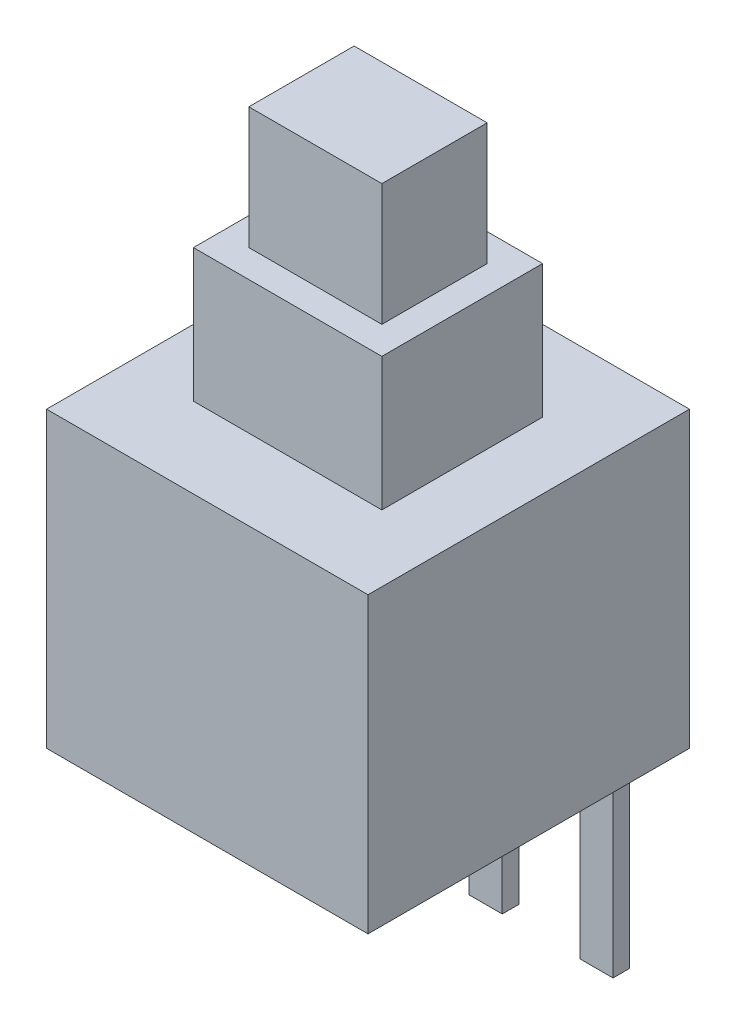
ISO-10303-21;
HEADER;
FILE_DESCRIPTION(('STEP AP214'),'2;1');
FILE_NAME('part.step','',(''),(''),'','','');
FILE_SCHEMA(('AUTOMOTIVE_DESIGN { 1 0 10303 214 1 1 1 1 }'));
ENDSEC;
DATA;
#1=APPLICATION_CONTEXT('core data for automotive mechanical design processes');
#2=APPLICATION_PROTOCOL_DEFINITION('international standard','automotive_design',2000,#1);
#3=PRODUCT_CONTEXT('',#1,'mechanical');
#4=PRODUCT('Part','Part','',(#3));
#5=PRODUCT_RELATED_PRODUCT_CATEGORY('part','',(#4));
#6=PRODUCT_DEFINITION_FORMATION('','',#4);
#7=PRODUCT_DEFINITION_CONTEXT('part definition',#1,'design');
#8=PRODUCT_DEFINITION('design','',#6,#7);
#9=PRODUCT_DEFINITION_SHAPE('','',#8);
#10=(LENGTH_UNIT() NAMED_UNIT(*) SI_UNIT(.MILLI.,.METRE.));
#11=(NAMED_UNIT(*) PLANE_ANGLE_UNIT() SI_UNIT($,.RADIAN.));
#12=(NAMED_UNIT(*) SI_UNIT($,.STERADIAN.) SOLID_ANGLE_UNIT());
#13=UNCERTAINTY_MEASURE_WITH_UNIT(LENGTH_MEASURE(1.E-05),#10,'distance_accuracy_value','');
#14=(GEOMETRIC_REPRESENTATION_CONTEXT(3) GLOBAL_UNCERTAINTY_ASSIGNED_CONTEXT((#13)) GLOBAL_UNIT_ASSIGNED_CONTEXT((#10,
#11,#12)) REPRESENTATION_CONTEXT('',''));
#15=CARTESIAN_POINT('',(0.,0.,0.));
#16=DIRECTION('',(0.,0.,1.));
#17=DIRECTION('',(1.,0.,0.));
#18=AXIS2_PLACEMENT_3D('',#15,#16,#17);
#19=CARTESIAN_POINT('',(0.,0.,0.));
#20=DIRECTION('',(0.,1.,0.));
#21=DIRECTION('',(0.,0.,1.));
#22=AXIS2_PLACEMENT_3D('',#19,#20,#21);
#23=PLANE('',#22);
#24=DIRECTION('',(0.,0.,-1.));
#25=VECTOR('',#24,1.);
#26=CARTESIAN_POINT('',(-2.3,0.,-2.42183407061702));
#27=LINE('',#26,#25);
#28=CARTESIAN_POINT('',(-2.3,0.,-2.12183407061702));
#29=VERTEX_POINT('',#28);
#30=CARTESIAN_POINT('',(-2.3,0.,-2.42183407061702));
#31=VERTEX_POINT('',#30);
#32=EDGE_CURVE('E216',#29,#31,#27,.T.);
#33=ORIENTED_EDGE('',*,*,#32,.F.);
#34=DIRECTION('',(-1.,0.,0.));
#35=VECTOR('',#34,1.);
#36=CARTESIAN_POINT('',(-1.7,0.,-2.12183407061702));
#37=LINE('',#36,#35);
#38=CARTESIAN_POINT('',(-1.7,0.,-2.12183407061702));
#39=VERTEX_POINT('',#38);
#40=EDGE_CURVE('E229',#39,#29,#37,.T.);
#41=ORIENTED_EDGE('',*,*,#40,.F.);
#42=DIRECTION('',(0.,0.,1.));
#43=VECTOR('',#42,1.);
#44=CARTESIAN_POINT('',(-1.7,0.,-2.42183407061702));
#45=LINE('',#44,#43);
#46=CARTESIAN_POINT('',(-1.7,0.,-2.42183407061702));
#47=VERTEX_POINT('',#46);
#48=EDGE_CURVE('E238',#47,#39,#45,.T.);
#49=ORIENTED_EDGE('',*,*,#48,.F.);
#50=DIRECTION('',(1.,0.,0.));
#51=VECTOR('',#50,1.);
#52=CARTESIAN_POINT('',(-1.7,0.,-2.42183407061702));
#53=LINE('',#52,#51);
#54=EDGE_CURVE('E219',#31,#47,#53,.T.);
#55=ORIENTED_EDGE('',*,*,#54,.F.);
#56=EDGE_LOOP('',(#33,#41,#49,#55));
#57=FACE_BOUND('',#56,.T.);
#58=DIRECTION('',(0.,0.,-1.));
#59=VECTOR('',#58,1.);
#60=CARTESIAN_POINT('',(2.9,0.,-2.9));
#61=LINE('',#60,#59);
#62=CARTESIAN_POINT('',(2.9,0.,2.9));
#63=VERTEX_POINT('',#62);
#64=CARTESIAN_POINT('',(2.9,0.,-2.9));
#65=VERTEX_POINT('',#64);
#66=EDGE_CURVE('E353',#63,#65,#61,.T.);
#67=ORIENTED_EDGE('',*,*,#66,.F.);
#68=DIRECTION('',(1.,0.,0.));
#69=VECTOR('',#68,1.);
#70=CARTESIAN_POINT('',(-2.9,0.,2.9));
#71=LINE('',#70,#69);
#72=CARTESIAN_POINT('',(-2.9,0.,2.9));
#73=VERTEX_POINT('',#72);
#74=EDGE_CURVE('E358',#73,#63,#71,.T.);
#75=ORIENTED_EDGE('',*,*,#74,.F.);
#76=DIRECTION('',(0.,0.,1.));
#77=VECTOR('',#76,1.);
#78=CARTESIAN_POINT('',(-2.9,0.,-2.9));
#79=LINE('',#78,#77);
#80=CARTESIAN_POINT('',(-2.9,0.,-2.9));
#81=VERTEX_POINT('',#80);
#82=EDGE_CURVE('E369',#81,#73,#79,.T.);
#83=ORIENTED_EDGE('',*,*,#82,.F.);
#84=DIRECTION('',(-1.,0.,0.));
#85=VECTOR('',#84,1.);
#86=CARTESIAN_POINT('',(-2.9,0.,-2.9));
#87=LINE('',#86,#85);
#88=EDGE_CURVE('E367',#65,#81,#87,.T.);
#89=ORIENTED_EDGE('',*,*,#88,.F.);
#90=EDGE_LOOP('',(#67,#75,#83,#89));
#91=FACE_BOUND('',#90,.T.);
#92=DIRECTION('',(0.,0.,-1.));
#93=VECTOR('',#92,1.);
#94=CARTESIAN_POINT('',(-0.3,0.,-2.42183407061702));
#95=LINE('',#94,#93);
#96=CARTESIAN_POINT('',(-0.3,0.,-2.12183407061702));
#97=VERTEX_POINT('',#96);
#98=CARTESIAN_POINT('',(-0.3,0.,-2.42183407061702));
#99=VERTEX_POINT('',#98);
#100=EDGE_CURVE('E254',#97,#99,#95,.T.);
#101=ORIENTED_EDGE('',*,*,#100,.F.);
#102=DIRECTION('',(-1.,0.,0.));
#103=VECTOR('',#102,1.);
#104=CARTESIAN_POINT('',(0.3,0.,-2.12183407061702));
#105=LINE('',#104,#103);
#106=CARTESIAN_POINT('',(0.3,0.,-2.12183407061702));
#107=VERTEX_POINT('',#106);
#108=EDGE_CURVE('E259',#107,#97,#105,.T.);
#109=ORIENTED_EDGE('',*,*,#108,.F.);
#110=DIRECTION('',(0.,0.,1.));
#111=VECTOR('',#110,1.);
#112=CARTESIAN_POINT('',(0.3,0.,-2.42183407061702));
#113=LINE('',#112,#111);
#114=CARTESIAN_POINT('',(0.3,0.,-2.42183407061702));
#115=VERTEX_POINT('',#114);
#116=EDGE_CURVE('E271',#115,#107,#113,.T.);
#117=ORIENTED_EDGE('',*,*,#116,.F.);
#118=DIRECTION('',(1.,0.,0.));
#119=VECTOR('',#118,1.);
#120=CARTESIAN_POINT('',(0.3,0.,-2.42183407061702));
#121=LINE('',#120,#119);
#122=EDGE_CURVE('E268',#99,#115,#121,.T.);
#123=ORIENTED_EDGE('',*,*,#122,.F.);
#124=EDGE_LOOP('',(#101,#109,#117,#123));
#125=FACE_BOUND('',#124,.T.);
#126=DIRECTION('',(0.,0.,-1.));
#127=VECTOR('',#126,1.);
#128=CARTESIAN_POINT('',(1.7,0.,-2.42183407061702));
#129=LINE('',#128,#127);
#130=CARTESIAN_POINT('',(1.7,0.,-2.12183407061702));
#131=VERTEX_POINT('',#130);
#132=CARTESIAN_POINT('',(1.7,0.,-2.42183407061702));
#133=VERTEX_POINT('',#132);
#134=EDGE_CURVE('E215',#131,#133,#129,.T.);
#135=ORIENTED_EDGE('',*,*,#134,.F.);
#136=DIRECTION('',(-1.,0.,0.));
#137=VECTOR('',#136,1.);
#138=CARTESIAN_POINT('',(2.3,0.,-2.12183407061702));
#139=LINE('',#138,#137);
#140=CARTESIAN_POINT('',(2.3,0.,-2.12183407061702));
#141=VERTEX_POINT('',#140);
#142=EDGE_CURVE('E212',#141,#131,#139,.T.);
#143=ORIENTED_EDGE('',*,*,#142,.F.);
#144=DIRECTION('',(0.,0.,1.));
#145=VECTOR('',#144,1.);
#146=CARTESIAN_POINT('',(2.3,0.,-2.42183407061702));
#147=LINE('',#146,#145);
#148=CARTESIAN_POINT('',(2.3,0.,-2.42183407061702));
#149=VERTEX_POINT('',#148);
#150=EDGE_CURVE('E54',#149,#141,#147,.T.);
#151=ORIENTED_EDGE('',*,*,#150,.F.);
#152=DIRECTION('',(1.,0.,0.));
#153=VECTOR('',#152,1.);
#154=CARTESIAN_POINT('',(2.3,0.,-2.42183407061702));
#155=LINE('',#154,#153);
#156=EDGE_CURVE('E49',#133,#149,#155,.T.);
#157=ORIENTED_EDGE('',*,*,#156,.F.);
#158=EDGE_LOOP('',(#135,#143,#151,#157));
#159=FACE_BOUND('',#158,.T.);
#160=ADVANCED_FACE('F34',(#57,#91,#125,#159),#23,.F.);
#161=CARTESIAN_POINT('',(2.9,5.3,-2.9));
#162=DIRECTION('',(-1.,0.,0.));
#163=DIRECTION('',(0.,0.,1.));
#164=AXIS2_PLACEMENT_3D('',#161,#162,#163);
#165=PLANE('',#164);
#166=ORIENTED_EDGE('',*,*,#66,.T.);
#167=DIRECTION('',(0.,-1.,0.));
#168=VECTOR('',#167,1.);
#169=CARTESIAN_POINT('',(2.9,5.3,-2.9));
#170=LINE('',#169,#168);
#171=CARTESIAN_POINT('',(2.9,5.3,-2.9));
#172=VERTEX_POINT('',#171);
#173=EDGE_CURVE('E11',#172,#65,#170,.T.);
#174=ORIENTED_EDGE('',*,*,#173,.F.);
#175=DIRECTION('',(0.,0.,-1.));
#176=VECTOR('',#175,1.);
#177=CARTESIAN_POINT('',(2.9,5.3,-2.9));
#178=LINE('',#177,#176);
#179=CARTESIAN_POINT('',(2.9,5.3,2.9));
#180=VERTEX_POINT('',#179);
#181=EDGE_CURVE('E354',#180,#172,#178,.T.);
#182=ORIENTED_EDGE('',*,*,#181,.F.);
#183=DIRECTION('',(0.,-1.,0.));
#184=VECTOR('',#183,1.);
#185=CARTESIAN_POINT('',(2.9,5.3,2.9));
#186=LINE('',#185,#184);
#187=EDGE_CURVE('E364',#180,#63,#186,.T.);
#188=ORIENTED_EDGE('',*,*,#187,.T.);
#189=EDGE_LOOP('',(#166,#174,#182,#188));
#190=FACE_BOUND('',#189,.T.);
#191=ADVANCED_FACE('F36',(#190),#165,.F.);
#192=CARTESIAN_POINT('',(-2.9,5.3,-2.9));
#193=DIRECTION('',(0.,0.,1.));
#194=DIRECTION('',(1.,0.,0.));
#195=AXIS2_PLACEMENT_3D('',#192,#193,#194);
#196=PLANE('',#195);
#197=ORIENTED_EDGE('',*,*,#88,.T.);
#198=DIRECTION('',(0.,-1.,0.));
#199=VECTOR('',#198,1.);
#200=CARTESIAN_POINT('',(-2.9,5.3,-2.9));
#201=LINE('',#200,#199);
#202=CARTESIAN_POINT('',(-2.9,5.3,-2.9));
#203=VERTEX_POINT('',#202);
#204=EDGE_CURVE('E42',#203,#81,#201,.T.);
#205=ORIENTED_EDGE('',*,*,#204,.F.);
#206=DIRECTION('',(-1.,0.,0.));
#207=VECTOR('',#206,1.);
#208=CARTESIAN_POINT('',(-2.9,5.3,-2.9));
#209=LINE('',#208,#207);
#210=EDGE_CURVE('E357',#172,#203,#209,.T.);
#211=ORIENTED_EDGE('',*,*,#210,.F.);
#212=ORIENTED_EDGE('',*,*,#173,.T.);
#213=EDGE_LOOP('',(#197,#205,#211,#212));
#214=FACE_BOUND('',#213,.T.);
#215=ADVANCED_FACE('F397',(#214),#196,.F.);
#216=CARTESIAN_POINT('',(-2.9,5.3,-2.9));
#217=DIRECTION('',(1.,0.,0.));
#218=DIRECTION('',(0.,0.,-1.));
#219=AXIS2_PLACEMENT_3D('',#216,#217,#218);
#220=PLANE('',#219);
#221=ORIENTED_EDGE('',*,*,#82,.T.);
#222=DIRECTION('',(0.,-1.,0.));
#223=VECTOR('',#222,1.);
#224=CARTESIAN_POINT('',(-2.9,5.3,2.9));
#225=LINE('',#224,#223);
#226=CARTESIAN_POINT('',(-2.9,5.3,2.9));
#227=VERTEX_POINT('',#226);
#228=EDGE_CURVE('E374',#227,#73,#225,.T.);
#229=ORIENTED_EDGE('',*,*,#228,.F.);
#230=DIRECTION('',(0.,0.,1.));
#231=VECTOR('',#230,1.);
#232=CARTESIAN_POINT('',(-2.9,5.3,-2.9));
#233=LINE('',#232,#231);
#234=EDGE_CURVE('E360',#203,#227,#233,.T.);
#235=ORIENTED_EDGE('',*,*,#234,.F.);
#236=ORIENTED_EDGE('',*,*,#204,.T.);
#237=EDGE_LOOP('',(#221,#229,#235,#236));
#238=FACE_BOUND('',#237,.T.);
#239=ADVANCED_FACE('F381',(#238),#220,.F.);
#240=CARTESIAN_POINT('',(-2.9,5.3,2.9));
#241=DIRECTION('',(0.,0.,-1.));
#242=DIRECTION('',(-1.,0.,0.));
#243=AXIS2_PLACEMENT_3D('',#240,#241,#242);
#244=PLANE('',#243);
#245=ORIENTED_EDGE('',*,*,#74,.T.);
#246=ORIENTED_EDGE('',*,*,#187,.F.);
#247=DIRECTION('',(1.,0.,0.));
#248=VECTOR('',#247,1.);
#249=CARTESIAN_POINT('',(-2.9,5.3,2.9));
#250=LINE('',#249,#248);
#251=EDGE_CURVE('E362',#227,#180,#250,.T.);
#252=ORIENTED_EDGE('',*,*,#251,.F.);
#253=ORIENTED_EDGE('',*,*,#228,.T.);
#254=EDGE_LOOP('',(#245,#246,#252,#253));
#255=FACE_BOUND('',#254,.T.);
#256=ADVANCED_FACE('F390',(#255),#244,.F.);
#257=CARTESIAN_POINT('',(0.,5.3,0.));
#258=DIRECTION('',(0.,1.,0.));
#259=DIRECTION('',(0.,0.,1.));
#260=AXIS2_PLACEMENT_3D('',#257,#258,#259);
#261=PLANE('',#260);
#262=DIRECTION('',(0.,0.,-1.));
#263=VECTOR('',#262,1.);
#264=CARTESIAN_POINT('',(1.7,5.3,-1.45));
#265=LINE('',#264,#263);
#266=CARTESIAN_POINT('',(1.7,5.3,1.45));
#267=VERTEX_POINT('',#266);
#268=CARTESIAN_POINT('',(1.7,5.3,-1.45));
#269=VERTEX_POINT('',#268);
#270=EDGE_CURVE('E320',#267,#269,#265,.T.);
#271=ORIENTED_EDGE('',*,*,#270,.F.);
#272=DIRECTION('',(1.,0.,0.));
#273=VECTOR('',#272,1.);
#274=CARTESIAN_POINT('',(-1.7,5.3,1.45));
#275=LINE('',#274,#273);
#276=CARTESIAN_POINT('',(-1.7,5.3,1.45));
#277=VERTEX_POINT('',#276);
#278=EDGE_CURVE('E325',#277,#267,#275,.T.);
#279=ORIENTED_EDGE('',*,*,#278,.F.);
#280=DIRECTION('',(0.,0.,1.));
#281=VECTOR('',#280,1.);
#282=CARTESIAN_POINT('',(-1.7,5.3,-1.45));
#283=LINE('',#282,#281);
#284=CARTESIAN_POINT('',(-1.7,5.3,-1.45));
#285=VERTEX_POINT('',#284);
#286=EDGE_CURVE('E337',#285,#277,#283,.T.);
#287=ORIENTED_EDGE('',*,*,#286,.F.);
#288=DIRECTION('',(-1.,0.,0.));
#289=VECTOR('',#288,1.);
#290=CARTESIAN_POINT('',(-1.7,5.3,-1.45));
#291=LINE('',#290,#289);
#292=EDGE_CURVE('E334',#269,#285,#291,.T.);
#293=ORIENTED_EDGE('',*,*,#292,.F.);
#294=EDGE_LOOP('',(#271,#279,#287,#293));
#295=FACE_BOUND('',#294,.T.);
#296=ORIENTED_EDGE('',*,*,#181,.T.);
#297=ORIENTED_EDGE('',*,*,#210,.T.);
#298=ORIENTED_EDGE('',*,*,#234,.T.);
#299=ORIENTED_EDGE('',*,*,#251,.T.);
#300=EDGE_LOOP('',(#296,#297,#298,#299));
#301=FACE_BOUND('',#300,.T.);
#302=ADVANCED_FACE('F396',(#295,#301),#261,.T.);
#303=CARTESIAN_POINT('',(1.7,7.7,-1.45));
#304=DIRECTION('',(-1.,0.,0.));
#305=DIRECTION('',(0.,0.,1.));
#306=AXIS2_PLACEMENT_3D('',#303,#304,#305);
#307=PLANE('',#306);
#308=ORIENTED_EDGE('',*,*,#270,.T.);
#309=DIRECTION('',(0.,-1.,0.));
#310=VECTOR('',#309,1.);
#311=CARTESIAN_POINT('',(1.7,7.7,-1.45));
#312=LINE('',#311,#310);
#313=CARTESIAN_POINT('',(1.7,7.7,-1.45));
#314=VERTEX_POINT('',#313);
#315=EDGE_CURVE('E350',#314,#269,#312,.T.);
#316=ORIENTED_EDGE('',*,*,#315,.F.);
#317=DIRECTION('',(0.,0.,-1.));
#318=VECTOR('',#317,1.);
#319=CARTESIAN_POINT('',(1.7,7.7,-1.45));
#320=LINE('',#319,#318);
#321=CARTESIAN_POINT('',(1.7,7.7,1.45));
#322=VERTEX_POINT('',#321);
#323=EDGE_CURVE('E321',#322,#314,#320,.T.);
#324=ORIENTED_EDGE('',*,*,#323,.F.);
#325=DIRECTION('',(0.,-1.,0.));
#326=VECTOR('',#325,1.);
#327=CARTESIAN_POINT('',(1.7,7.7,1.45));
#328=LINE('',#327,#326);
#329=EDGE_CURVE('E331',#322,#267,#328,.T.);
#330=ORIENTED_EDGE('',*,*,#329,.T.);
#331=EDGE_LOOP('',(#308,#316,#324,#330));
#332=FACE_BOUND('',#331,.T.);
#333=ADVANCED_FACE('F416',(#332),#307,.F.);
#334=CARTESIAN_POINT('',(-1.7,7.7,-1.45));
#335=DIRECTION('',(0.,0.,1.));
#336=DIRECTION('',(1.,0.,0.));
#337=AXIS2_PLACEMENT_3D('',#334,#335,#336);
#338=PLANE('',#337);
#339=ORIENTED_EDGE('',*,*,#292,.T.);
#340=DIRECTION('',(0.,-1.,0.));
#341=VECTOR('',#340,1.);
#342=CARTESIAN_POINT('',(-1.7,7.7,-1.45));
#343=LINE('',#342,#341);
#344=CARTESIAN_POINT('',(-1.7,7.7,-1.45));
#345=VERTEX_POINT('',#344);
#346=EDGE_CURVE('E347',#345,#285,#343,.T.);
#347=ORIENTED_EDGE('',*,*,#346,.F.);
#348=DIRECTION('',(-1.,0.,0.));
#349=VECTOR('',#348,1.);
#350=CARTESIAN_POINT('',(-1.7,7.7,-1.45));
#351=LINE('',#350,#349);
#352=EDGE_CURVE('E324',#314,#345,#351,.T.);
#353=ORIENTED_EDGE('',*,*,#352,.F.);
#354=ORIENTED_EDGE('',*,*,#315,.T.);
#355=EDGE_LOOP('',(#339,#347,#353,#354));
#356=FACE_BOUND('',#355,.T.);
#357=ADVANCED_FACE('F421',(#356),#338,.F.);
#358=CARTESIAN_POINT('',(-1.7,7.7,-1.45));
#359=DIRECTION('',(1.,0.,0.));
#360=DIRECTION('',(0.,0.,-1.));
#361=AXIS2_PLACEMENT_3D('',#358,#359,#360);
#362=PLANE('',#361);
#363=ORIENTED_EDGE('',*,*,#286,.T.);
#364=DIRECTION('',(0.,-1.,0.));
#365=VECTOR('',#364,1.);
#366=CARTESIAN_POINT('',(-1.7,7.7,1.45));
#367=LINE('',#366,#365);
#368=CARTESIAN_POINT('',(-1.7,7.7,1.45));
#369=VERTEX_POINT('',#368);
#370=EDGE_CURVE('E344',#369,#277,#367,.T.);
#371=ORIENTED_EDGE('',*,*,#370,.F.);
#372=DIRECTION('',(0.,0.,1.));
#373=VECTOR('',#372,1.);
#374=CARTESIAN_POINT('',(-1.7,7.7,-1.45));
#375=LINE('',#374,#373);
#376=EDGE_CURVE('E327',#345,#369,#375,.T.);
#377=ORIENTED_EDGE('',*,*,#376,.F.);
#378=ORIENTED_EDGE('',*,*,#346,.T.);
#379=EDGE_LOOP('',(#363,#371,#377,#378));
#380=FACE_BOUND('',#379,.T.);
#381=ADVANCED_FACE('F435',(#380),#362,.F.);
#382=CARTESIAN_POINT('',(-1.7,7.7,1.45));
#383=DIRECTION('',(0.,0.,-1.));
#384=DIRECTION('',(-1.,0.,0.));
#385=AXIS2_PLACEMENT_3D('',#382,#383,#384);
#386=PLANE('',#385);
#387=ORIENTED_EDGE('',*,*,#278,.T.);
#388=ORIENTED_EDGE('',*,*,#329,.F.);
#389=DIRECTION('',(1.,0.,0.));
#390=VECTOR('',#389,1.);
#391=CARTESIAN_POINT('',(-1.7,7.7,1.45));
#392=LINE('',#391,#390);
#393=EDGE_CURVE('E329',#369,#322,#392,.T.);
#394=ORIENTED_EDGE('',*,*,#393,.F.);
#395=ORIENTED_EDGE('',*,*,#370,.T.);
#396=EDGE_LOOP('',(#387,#388,#394,#395));
#397=FACE_BOUND('',#396,.T.);
#398=ADVANCED_FACE('F426',(#397),#386,.F.);
#399=CARTESIAN_POINT('',(0.,7.7,0.));
#400=DIRECTION('',(0.,1.,0.));
#401=DIRECTION('',(0.,0.,1.));
#402=AXIS2_PLACEMENT_3D('',#399,#400,#401);
#403=PLANE('',#402);
#404=DIRECTION('',(1.,0.,0.));
#405=VECTOR('',#404,1.);
#406=CARTESIAN_POINT('',(-1.2,7.7,0.95));
#407=LINE('',#406,#405);
#408=CARTESIAN_POINT('',(-1.2,7.7,0.95));
#409=VERTEX_POINT('',#408);
#410=CARTESIAN_POINT('',(1.2,7.7,0.95));
#411=VERTEX_POINT('',#410);
#412=EDGE_CURVE('E287',#409,#411,#407,.T.);
#413=ORIENTED_EDGE('',*,*,#412,.F.);
#414=DIRECTION('',(0.,0.,1.));
#415=VECTOR('',#414,1.);
#416=CARTESIAN_POINT('',(-1.2,7.7,-0.95));
#417=LINE('',#416,#415);
#418=CARTESIAN_POINT('',(-1.2,7.7,-0.95));
#419=VERTEX_POINT('',#418);
#420=EDGE_CURVE('E292',#419,#409,#417,.T.);
#421=ORIENTED_EDGE('',*,*,#420,.F.);
#422=DIRECTION('',(-1.,0.,0.));
#423=VECTOR('',#422,1.);
#424=CARTESIAN_POINT('',(1.2,7.7,-0.95));
#425=LINE('',#424,#423);
#426=CARTESIAN_POINT('',(1.2,7.7,-0.95));
#427=VERTEX_POINT('',#426);
#428=EDGE_CURVE('E304',#427,#419,#425,.T.);
#429=ORIENTED_EDGE('',*,*,#428,.F.);
#430=DIRECTION('',(0.,0.,-1.));
#431=VECTOR('',#430,1.);
#432=CARTESIAN_POINT('',(1.2,7.7,0.95));
#433=LINE('',#432,#431);
#434=EDGE_CURVE('E301',#411,#427,#433,.T.);
#435=ORIENTED_EDGE('',*,*,#434,.F.);
#436=EDGE_LOOP('',(#413,#421,#429,#435));
#437=FACE_BOUND('',#436,.T.);
#438=ORIENTED_EDGE('',*,*,#323,.T.);
#439=ORIENTED_EDGE('',*,*,#352,.T.);
#440=ORIENTED_EDGE('',*,*,#376,.T.);
#441=ORIENTED_EDGE('',*,*,#393,.T.);
#442=EDGE_LOOP('',(#438,#439,#440,#441));
#443=FACE_BOUND('',#442,.T.);
#444=ADVANCED_FACE('F431',(#437,#443),#403,.T.);
#445=CARTESIAN_POINT('',(-1.2,9.9,0.95));
#446=DIRECTION('',(0.,0.,-1.));
#447=DIRECTION('',(-1.,0.,0.));
#448=AXIS2_PLACEMENT_3D('',#445,#446,#447);
#449=PLANE('',#448);
#450=ORIENTED_EDGE('',*,*,#412,.T.);
#451=DIRECTION('',(0.,-1.,0.));
#452=VECTOR('',#451,1.);
#453=CARTESIAN_POINT('',(1.2,9.9,0.95));
#454=LINE('',#453,#452);
#455=CARTESIAN_POINT('',(1.2,9.9,0.95));
#456=VERTEX_POINT('',#455);
#457=EDGE_CURVE('E317',#456,#411,#454,.T.);
#458=ORIENTED_EDGE('',*,*,#457,.F.);
#459=DIRECTION('',(1.,0.,0.));
#460=VECTOR('',#459,1.);
#461=CARTESIAN_POINT('',(-1.2,9.9,0.95));
#462=LINE('',#461,#460);
#463=CARTESIAN_POINT('',(-1.2,9.9,0.95));
#464=VERTEX_POINT('',#463);
#465=EDGE_CURVE('E288',#464,#456,#462,.T.);
#466=ORIENTED_EDGE('',*,*,#465,.F.);
#467=DIRECTION('',(0.,-1.,0.));
#468=VECTOR('',#467,1.);
#469=CARTESIAN_POINT('',(-1.2,9.9,0.95));
#470=LINE('',#469,#468);
#471=EDGE_CURVE('E298',#464,#409,#470,.T.);
#472=ORIENTED_EDGE('',*,*,#471,.T.);
#473=EDGE_LOOP('',(#450,#458,#466,#472));
#474=FACE_BOUND('',#473,.T.);
#475=ADVANCED_FACE('F448',(#474),#449,.F.);
#476=CARTESIAN_POINT('',(1.2,9.9,0.95));
#477=DIRECTION('',(-1.,0.,0.));
#478=DIRECTION('',(0.,0.,1.));
#479=AXIS2_PLACEMENT_3D('',#476,#477,#478);
#480=PLANE('',#479);
#481=ORIENTED_EDGE('',*,*,#434,.T.);
#482=DIRECTION('',(0.,-1.,0.));
#483=VECTOR('',#482,1.);
#484=CARTESIAN_POINT('',(1.2,9.9,-0.95));
#485=LINE('',#484,#483);
#486=CARTESIAN_POINT('',(1.2,9.9,-0.95));
#487=VERTEX_POINT('',#486);
#488=EDGE_CURVE('E314',#487,#427,#485,.T.);
#489=ORIENTED_EDGE('',*,*,#488,.F.);
#490=DIRECTION('',(0.,0.,-1.));
#491=VECTOR('',#490,1.);
#492=CARTESIAN_POINT('',(1.2,9.9,0.95));
#493=LINE('',#492,#491);
#494=EDGE_CURVE('E291',#456,#487,#493,.T.);
#495=ORIENTED_EDGE('',*,*,#494,.F.);
#496=ORIENTED_EDGE('',*,*,#457,.T.);
#497=EDGE_LOOP('',(#481,#489,#495,#496));
#498=FACE_BOUND('',#497,.T.);
#499=ADVANCED_FACE('F452',(#498),#480,.F.);
#500=CARTESIAN_POINT('',(1.2,9.9,-0.95));
#501=DIRECTION('',(0.,0.,1.));
#502=DIRECTION('',(1.,0.,0.));
#503=AXIS2_PLACEMENT_3D('',#500,#501,#502);
#504=PLANE('',#503);
#505=ORIENTED_EDGE('',*,*,#428,.T.);
#506=DIRECTION('',(0.,-1.,0.));
#507=VECTOR('',#506,1.);
#508=CARTESIAN_POINT('',(-1.2,9.9,-0.95));
#509=LINE('',#508,#507);
#510=CARTESIAN_POINT('',(-1.2,9.9,-0.95));
#511=VERTEX_POINT('',#510);
#512=EDGE_CURVE('E311',#511,#419,#509,.T.);
#513=ORIENTED_EDGE('',*,*,#512,.F.);
#514=DIRECTION('',(-1.,0.,0.));
#515=VECTOR('',#514,1.);
#516=CARTESIAN_POINT('',(1.2,9.9,-0.95));
#517=LINE('',#516,#515);
#518=EDGE_CURVE('E294',#487,#511,#517,.T.);
#519=ORIENTED_EDGE('',*,*,#518,.F.);
#520=ORIENTED_EDGE('',*,*,#488,.T.);
#521=EDGE_LOOP('',(#505,#513,#519,#520));
#522=FACE_BOUND('',#521,.T.);
#523=ADVANCED_FACE('F456',(#522),#504,.F.);
#524=CARTESIAN_POINT('',(-1.2,9.9,-0.95));
#525=DIRECTION('',(1.,0.,0.));
#526=DIRECTION('',(0.,0.,-1.));
#527=AXIS2_PLACEMENT_3D('',#524,#525,#526);
#528=PLANE('',#527);
#529=ORIENTED_EDGE('',*,*,#420,.T.);
#530=ORIENTED_EDGE('',*,*,#471,.F.);
#531=DIRECTION('',(0.,0.,1.));
#532=VECTOR('',#531,1.);
#533=CARTESIAN_POINT('',(-1.2,9.9,-0.95));
#534=LINE('',#533,#532);
#535=EDGE_CURVE('E296',#511,#464,#534,.T.);
#536=ORIENTED_EDGE('',*,*,#535,.F.);
#537=ORIENTED_EDGE('',*,*,#512,.T.);
#538=EDGE_LOOP('',(#529,#530,#536,#537));
#539=FACE_BOUND('',#538,.T.);
#540=ADVANCED_FACE('F460',(#539),#528,.F.);
#541=CARTESIAN_POINT('',(0.,9.9,0.));
#542=DIRECTION('',(0.,1.,0.));
#543=DIRECTION('',(0.,0.,1.));
#544=AXIS2_PLACEMENT_3D('',#541,#542,#543);
#545=PLANE('',#544);
#546=ORIENTED_EDGE('',*,*,#465,.T.);
#547=ORIENTED_EDGE('',*,*,#494,.T.);
#548=ORIENTED_EDGE('',*,*,#518,.T.);
#549=ORIENTED_EDGE('',*,*,#535,.T.);
#550=EDGE_LOOP('',(#546,#547,#548,#549));
#551=FACE_BOUND('',#550,.T.);
#552=ADVANCED_FACE('F464',(#551),#545,.T.);
#553=CARTESIAN_POINT('',(-0.3,-3.5,-2.42183407061702));
#554=DIRECTION('',(1.,0.,0.));
#555=DIRECTION('',(0.,0.,-1.));
#556=AXIS2_PLACEMENT_3D('',#553,#554,#555);
#557=PLANE('',#556);
#558=ORIENTED_EDGE('',*,*,#100,.T.);
#559=DIRECTION('',(0.,1.,0.));
#560=VECTOR('',#559,1.);
#561=CARTESIAN_POINT('',(-0.3,-3.5,-2.42183407061702));
#562=LINE('',#561,#560);
#563=CARTESIAN_POINT('',(-0.3,-3.5,-2.42183407061702));
#564=VERTEX_POINT('',#563);
#565=EDGE_CURVE('E284',#564,#99,#562,.T.);
#566=ORIENTED_EDGE('',*,*,#565,.F.);
#567=DIRECTION('',(0.,0.,-1.));
#568=VECTOR('',#567,1.);
#569=CARTESIAN_POINT('',(-0.3,-3.5,-2.42183407061702));
#570=LINE('',#569,#568);
#571=CARTESIAN_POINT('',(-0.3,-3.5,-2.12183407061702));
#572=VERTEX_POINT('',#571);
#573=EDGE_CURVE('E255',#572,#564,#570,.T.);
#574=ORIENTED_EDGE('',*,*,#573,.F.);
#575=DIRECTION('',(0.,1.,0.));
#576=VECTOR('',#575,1.);
#577=CARTESIAN_POINT('',(-0.3,-3.5,-2.12183407061702));
#578=LINE('',#577,#576);
#579=EDGE_CURVE('E265',#572,#97,#578,.T.);
#580=ORIENTED_EDGE('',*,*,#579,.T.);
#581=EDGE_LOOP('',(#558,#566,#574,#580));
#582=FACE_BOUND('',#581,.T.);
#583=ADVANCED_FACE('F468',(#582),#557,.F.);
#584=CARTESIAN_POINT('',(0.3,-3.5,-2.42183407061702));
#585=DIRECTION('',(0.,0.,1.));
#586=DIRECTION('',(1.,0.,0.));
#587=AXIS2_PLACEMENT_3D('',#584,#585,#586);
#588=PLANE('',#587);
#589=ORIENTED_EDGE('',*,*,#122,.T.);
#590=DIRECTION('',(0.,1.,0.));
#591=VECTOR('',#590,1.);
#592=CARTESIAN_POINT('',(0.3,-3.5,-2.42183407061702));
#593=LINE('',#592,#591);
#594=CARTESIAN_POINT('',(0.3,-3.5,-2.42183407061702));
#595=VERTEX_POINT('',#594);
#596=EDGE_CURVE('E281',#595,#115,#593,.T.);
#597=ORIENTED_EDGE('',*,*,#596,.F.);
#598=DIRECTION('',(1.,0.,0.));
#599=VECTOR('',#598,1.);
#600=CARTESIAN_POINT('',(0.3,-3.5,-2.42183407061702));
#601=LINE('',#600,#599);
#602=EDGE_CURVE('E258',#564,#595,#601,.T.);
#603=ORIENTED_EDGE('',*,*,#602,.F.);
#604=ORIENTED_EDGE('',*,*,#565,.T.);
#605=EDGE_LOOP('',(#589,#597,#603,#604));
#606=FACE_BOUND('',#605,.T.);
#607=ADVANCED_FACE('F472',(#606),#588,.F.);
#608=CARTESIAN_POINT('',(0.3,-3.5,-2.42183407061702));
#609=DIRECTION('',(-1.,0.,0.));
#610=DIRECTION('',(0.,0.,1.));
#611=AXIS2_PLACEMENT_3D('',#608,#609,#610);
#612=PLANE('',#611);
#613=ORIENTED_EDGE('',*,*,#116,.T.);
#614=DIRECTION('',(0.,1.,0.));
#615=VECTOR('',#614,1.);
#616=CARTESIAN_POINT('',(0.3,-3.5,-2.12183407061702));
#617=LINE('',#616,#615);
#618=CARTESIAN_POINT('',(0.3,-3.5,-2.12183407061702));
#619=VERTEX_POINT('',#618);
#620=EDGE_CURVE('E278',#619,#107,#617,.T.);
#621=ORIENTED_EDGE('',*,*,#620,.F.);
#622=DIRECTION('',(0.,0.,1.));
#623=VECTOR('',#622,1.);
#624=CARTESIAN_POINT('',(0.3,-3.5,-2.42183407061702));
#625=LINE('',#624,#623);
#626=EDGE_CURVE('E261',#595,#619,#625,.T.);
#627=ORIENTED_EDGE('',*,*,#626,.F.);
#628=ORIENTED_EDGE('',*,*,#596,.T.);
#629=EDGE_LOOP('',(#613,#621,#627,#628));
#630=FACE_BOUND('',#629,.T.);
#631=ADVANCED_FACE('F476',(#630),#612,.F.);
#632=CARTESIAN_POINT('',(0.3,-3.5,-2.12183407061702));
#633=DIRECTION('',(0.,0.,-1.));
#634=DIRECTION('',(-1.,0.,0.));
#635=AXIS2_PLACEMENT_3D('',#632,#633,#634);
#636=PLANE('',#635);
#637=ORIENTED_EDGE('',*,*,#108,.T.);
#638=ORIENTED_EDGE('',*,*,#579,.F.);
#639=DIRECTION('',(-1.,0.,0.));
#640=VECTOR('',#639,1.);
#641=CARTESIAN_POINT('',(0.3,-3.5,-2.12183407061702));
#642=LINE('',#641,#640);
#643=EDGE_CURVE('E263',#619,#572,#642,.T.);
#644=ORIENTED_EDGE('',*,*,#643,.F.);
#645=ORIENTED_EDGE('',*,*,#620,.T.);
#646=EDGE_LOOP('',(#637,#638,#644,#645));
#647=FACE_BOUND('',#646,.T.);
#648=ADVANCED_FACE('F480',(#647),#636,.F.);
#649=CARTESIAN_POINT('',(0.,-3.5,0.));
#650=DIRECTION('',(0.,-1.,0.));
#651=DIRECTION('',(0.,0.,-1.));
#652=AXIS2_PLACEMENT_3D('',#649,#650,#651);
#653=PLANE('',#652);
#654=ORIENTED_EDGE('',*,*,#573,.T.);
#655=ORIENTED_EDGE('',*,*,#602,.T.);
#656=ORIENTED_EDGE('',*,*,#626,.T.);
#657=ORIENTED_EDGE('',*,*,#643,.T.);
#658=EDGE_LOOP('',(#654,#655,#656,#657));
#659=FACE_BOUND('',#658,.T.);
#660=ADVANCED_FACE('F484',(#659),#653,.T.);
#661=CARTESIAN_POINT('',(-2.3,-3.5,-2.42183407061702));
#662=DIRECTION('',(1.,0.,0.));
#663=DIRECTION('',(0.,0.,-1.));
#664=AXIS2_PLACEMENT_3D('',#661,#662,#663);
#665=PLANE('',#664);
#666=ORIENTED_EDGE('',*,*,#32,.T.);
#667=DIRECTION('',(0.,1.,0.));
#668=VECTOR('',#667,1.);
#669=CARTESIAN_POINT('',(-2.3,-3.5,-2.42183407061702));
#670=LINE('',#669,#668);
#671=CARTESIAN_POINT('',(-2.3,-3.5,-2.42183407061702));
#672=VERTEX_POINT('',#671);
#673=EDGE_CURVE('E251',#672,#31,#670,.T.);
#674=ORIENTED_EDGE('',*,*,#673,.F.);
#675=DIRECTION('',(0.,0.,-1.));
#676=VECTOR('',#675,1.);
#677=CARTESIAN_POINT('',(-2.3,-3.5,-2.42183407061702));
#678=LINE('',#677,#676);
#679=CARTESIAN_POINT('',(-2.3,-3.5,-2.12183407061702));
#680=VERTEX_POINT('',#679);
#681=EDGE_CURVE('E225',#680,#672,#678,.T.);
#682=ORIENTED_EDGE('',*,*,#681,.F.);
#683=DIRECTION('',(0.,1.,0.));
#684=VECTOR('',#683,1.);
#685=CARTESIAN_POINT('',(-2.3,-3.5,-2.12183407061702));
#686=LINE('',#685,#684);
#687=EDGE_CURVE('E234',#680,#29,#686,.T.);
#688=ORIENTED_EDGE('',*,*,#687,.T.);
#689=EDGE_LOOP('',(#666,#674,#682,#688));
#690=FACE_BOUND('',#689,.T.);
#691=ADVANCED_FACE('F488',(#690),#665,.F.);
#692=CARTESIAN_POINT('',(-1.7,-3.5,-2.42183407061702));
#693=DIRECTION('',(0.,0.,1.));
#694=DIRECTION('',(1.,0.,0.));
#695=AXIS2_PLACEMENT_3D('',#692,#693,#694);
#696=PLANE('',#695);
#697=ORIENTED_EDGE('',*,*,#54,.T.);
#698=DIRECTION('',(0.,1.,0.));
#699=VECTOR('',#698,1.);
#700=CARTESIAN_POINT('',(-1.7,-3.5,-2.42183407061702));
#701=LINE('',#700,#699);
#702=CARTESIAN_POINT('',(-1.7,-3.5,-2.42183407061702));
#703=VERTEX_POINT('',#702);
#704=EDGE_CURVE('E248',#703,#47,#701,.T.);
#705=ORIENTED_EDGE('',*,*,#704,.F.);
#706=DIRECTION('',(1.,0.,0.));
#707=VECTOR('',#706,1.);
#708=CARTESIAN_POINT('',(-1.7,-3.5,-2.42183407061702));
#709=LINE('',#708,#707);
#710=EDGE_CURVE('E228',#672,#703,#709,.T.);
#711=ORIENTED_EDGE('',*,*,#710,.F.);
#712=ORIENTED_EDGE('',*,*,#673,.T.);
#713=EDGE_LOOP('',(#697,#705,#711,#712));
#714=FACE_BOUND('',#713,.T.);
#715=ADVANCED_FACE('F492',(#714),#696,.F.);
#716=CARTESIAN_POINT('',(-1.7,-3.5,-2.42183407061702));
#717=DIRECTION('',(-1.,0.,0.));
#718=DIRECTION('',(0.,0.,1.));
#719=AXIS2_PLACEMENT_3D('',#716,#717,#718);
#720=PLANE('',#719);
#721=ORIENTED_EDGE('',*,*,#48,.T.);
#722=DIRECTION('',(0.,1.,0.));
#723=VECTOR('',#722,1.);
#724=CARTESIAN_POINT('',(-1.7,-3.5,-2.12183407061702));
#725=LINE('',#724,#723);
#726=CARTESIAN_POINT('',(-1.7,-3.5,-2.12183407061702));
#727=VERTEX_POINT('',#726);
#728=EDGE_CURVE('E245',#727,#39,#725,.T.);
#729=ORIENTED_EDGE('',*,*,#728,.F.);
#730=DIRECTION('',(0.,0.,1.));
#731=VECTOR('',#730,1.);
#732=CARTESIAN_POINT('',(-1.7,-3.5,-2.42183407061702));
#733=LINE('',#732,#731);
#734=EDGE_CURVE('E231',#703,#727,#733,.T.);
#735=ORIENTED_EDGE('',*,*,#734,.F.);
#736=ORIENTED_EDGE('',*,*,#704,.T.);
#737=EDGE_LOOP('',(#721,#729,#735,#736));
#738=FACE_BOUND('',#737,.T.);
#739=ADVANCED_FACE('F496',(#738),#720,.F.);
#740=CARTESIAN_POINT('',(-1.7,-3.5,-2.12183407061702));
#741=DIRECTION('',(0.,0.,-1.));
#742=DIRECTION('',(-1.,0.,0.));
#743=AXIS2_PLACEMENT_3D('',#740,#741,#742);
#744=PLANE('',#743);
#745=ORIENTED_EDGE('',*,*,#40,.T.);
#746=ORIENTED_EDGE('',*,*,#687,.F.);
#747=DIRECTION('',(-1.,0.,0.));
#748=VECTOR('',#747,1.);
#749=CARTESIAN_POINT('',(-1.7,-3.5,-2.12183407061702));
#750=LINE('',#749,#748);
#751=EDGE_CURVE('E233',#727,#680,#750,.T.);
#752=ORIENTED_EDGE('',*,*,#751,.F.);
#753=ORIENTED_EDGE('',*,*,#728,.T.);
#754=EDGE_LOOP('',(#745,#746,#752,#753));
#755=FACE_BOUND('',#754,.T.);
#756=ADVANCED_FACE('F500',(#755),#744,.F.);
#757=CARTESIAN_POINT('',(0.,-3.5,0.));
#758=DIRECTION('',(0.,-1.,0.));
#759=DIRECTION('',(0.,0.,-1.));
#760=AXIS2_PLACEMENT_3D('',#757,#758,#759);
#761=PLANE('',#760);
#762=ORIENTED_EDGE('',*,*,#681,.T.);
#763=ORIENTED_EDGE('',*,*,#710,.T.);
#764=ORIENTED_EDGE('',*,*,#734,.T.);
#765=ORIENTED_EDGE('',*,*,#751,.T.);
#766=EDGE_LOOP('',(#762,#763,#764,#765));
#767=FACE_BOUND('',#766,.T.);
#768=ADVANCED_FACE('F504',(#767),#761,.T.);
#769=CARTESIAN_POINT('',(1.7,-3.5,-2.42183407061702));
#770=DIRECTION('',(1.,0.,0.));
#771=DIRECTION('',(0.,0.,-1.));
#772=AXIS2_PLACEMENT_3D('',#769,#770,#771);
#773=PLANE('',#772);
#774=ORIENTED_EDGE('',*,*,#134,.T.);
#775=DIRECTION('',(0.,1.,0.));
#776=VECTOR('',#775,1.);
#777=CARTESIAN_POINT('',(1.7,-3.5,-2.42183407061702));
#778=LINE('',#777,#776);
#779=CARTESIAN_POINT('',(1.7,-3.5,-2.42183407061702));
#780=VERTEX_POINT('',#779);
#781=EDGE_CURVE('E196',#780,#133,#778,.T.);
#782=ORIENTED_EDGE('',*,*,#781,.F.);
#783=DIRECTION('',(0.,0.,-1.));
#784=VECTOR('',#783,1.);
#785=CARTESIAN_POINT('',(1.7,-3.5,-2.42183407061702));
#786=LINE('',#785,#784);
#787=CARTESIAN_POINT('',(1.7,-3.5,-2.12183407061702));
#788=VERTEX_POINT('',#787);
#789=EDGE_CURVE('E203',#788,#780,#786,.T.);
#790=ORIENTED_EDGE('',*,*,#789,.F.);
#791=DIRECTION('',(0.,1.,0.));
#792=VECTOR('',#791,1.);
#793=CARTESIAN_POINT('',(1.7,-3.5,-2.12183407061702));
#794=LINE('',#793,#792);
#795=EDGE_CURVE('E732',#788,#131,#794,.T.);
#796=ORIENTED_EDGE('',*,*,#795,.T.);
#797=EDGE_LOOP('',(#774,#782,#790,#796));
#798=FACE_BOUND('',#797,.T.);
#799=ADVANCED_FACE('F214',(#798),#773,.F.);
#800=CARTESIAN_POINT('',(2.3,-3.5,-2.42183407061702));
#801=DIRECTION('',(0.,0.,1.));
#802=DIRECTION('',(1.,0.,0.));
#803=AXIS2_PLACEMENT_3D('',#800,#801,#802);
#804=PLANE('',#803);
#805=ORIENTED_EDGE('',*,*,#156,.T.);
#806=DIRECTION('',(0.,1.,0.));
#807=VECTOR('',#806,1.);
#808=CARTESIAN_POINT('',(2.3,-3.5,-2.42183407061702));
#809=LINE('',#808,#807);
#810=CARTESIAN_POINT('',(2.3,-3.5,-2.42183407061702));
#811=VERTEX_POINT('',#810);
#812=EDGE_CURVE('E199',#811,#149,#809,.T.);
#813=ORIENTED_EDGE('',*,*,#812,.F.);
#814=DIRECTION('',(1.,0.,0.));
#815=VECTOR('',#814,1.);
#816=CARTESIAN_POINT('',(2.3,-3.5,-2.42183407061702));
#817=LINE('',#816,#815);
#818=EDGE_CURVE('E192',#780,#811,#817,.T.);
#819=ORIENTED_EDGE('',*,*,#818,.F.);
#820=ORIENTED_EDGE('',*,*,#781,.T.);
#821=EDGE_LOOP('',(#805,#813,#819,#820));
#822=FACE_BOUND('',#821,.T.);
#823=ADVANCED_FACE('F194',(#822),#804,.F.);
#824=CARTESIAN_POINT('',(2.3,-3.5,-2.42183407061702));
#825=DIRECTION('',(-1.,0.,0.));
#826=DIRECTION('',(0.,0.,1.));
#827=AXIS2_PLACEMENT_3D('',#824,#825,#826);
#828=PLANE('',#827);
#829=ORIENTED_EDGE('',*,*,#150,.T.);
#830=DIRECTION('',(0.,1.,0.));
#831=VECTOR('',#830,1.);
#832=CARTESIAN_POINT('',(2.3,-3.5,-2.12183407061702));
#833=LINE('',#832,#831);
#834=CARTESIAN_POINT('',(2.3,-3.5,-2.12183407061702));
#835=VERTEX_POINT('',#834);
#836=EDGE_CURVE('E221',#835,#141,#833,.T.);
#837=ORIENTED_EDGE('',*,*,#836,.F.);
#838=DIRECTION('',(0.,0.,1.));
#839=VECTOR('',#838,1.);
#840=CARTESIAN_POINT('',(2.3,-3.5,-2.42183407061702));
#841=LINE('',#840,#839);
#842=EDGE_CURVE('E202',#811,#835,#841,.T.);
#843=ORIENTED_EDGE('',*,*,#842,.F.);
#844=ORIENTED_EDGE('',*,*,#812,.T.);
#845=EDGE_LOOP('',(#829,#837,#843,#844));
#846=FACE_BOUND('',#845,.T.);
#847=ADVANCED_FACE('F513',(#846),#828,.F.);
#848=CARTESIAN_POINT('',(2.3,-3.5,-2.12183407061702));
#849=DIRECTION('',(0.,0.,-1.));
#850=DIRECTION('',(-1.,0.,0.));
#851=AXIS2_PLACEMENT_3D('',#848,#849,#850);
#852=PLANE('',#851);
#853=ORIENTED_EDGE('',*,*,#142,.T.);
#854=ORIENTED_EDGE('',*,*,#795,.F.);
#855=DIRECTION('',(-1.,0.,0.));
#856=VECTOR('',#855,1.);
#857=CARTESIAN_POINT('',(2.3,-3.5,-2.12183407061702));
#858=LINE('',#857,#856);
#859=EDGE_CURVE('E208',#835,#788,#858,.T.);
#860=ORIENTED_EDGE('',*,*,#859,.F.);
#861=ORIENTED_EDGE('',*,*,#836,.T.);
#862=EDGE_LOOP('',(#853,#854,#860,#861));
#863=FACE_BOUND('',#862,.T.);
#864=ADVANCED_FACE('F516',(#863),#852,.F.);
#865=CARTESIAN_POINT('',(0.,-3.5,0.));
#866=DIRECTION('',(0.,-1.,0.));
#867=DIRECTION('',(0.,0.,-1.));
#868=AXIS2_PLACEMENT_3D('',#865,#866,#867);
#869=PLANE('',#868);
#870=ORIENTED_EDGE('',*,*,#789,.T.);
#871=ORIENTED_EDGE('',*,*,#818,.T.);
#872=ORIENTED_EDGE('',*,*,#842,.T.);
#873=ORIENTED_EDGE('',*,*,#859,.T.);
#874=EDGE_LOOP('',(#870,#871,#872,#873));
#875=FACE_BOUND('',#874,.T.);
#876=ADVANCED_FACE('F206',(#875),#869,.T.);
#877=CLOSED_SHELL('',(#160,#191,#215,#239,#256,#302,#333,#357,#381,#398,#444,#475,#499,#523,
#540,#552,#583,#607,#631,#648,#660,#691,#715,#739,#756,#768,#799,#823,#847,#864,#876));
#878=MANIFOLD_SOLID_BREP('B2',#877);
#879=ADVANCED_BREP_SHAPE_REPRESENTATION('',(#18,#878),#14);
#880=SHAPE_DEFINITION_REPRESENTATION(#9,#879);
ENDSEC;
END-ISO-10303-21;
